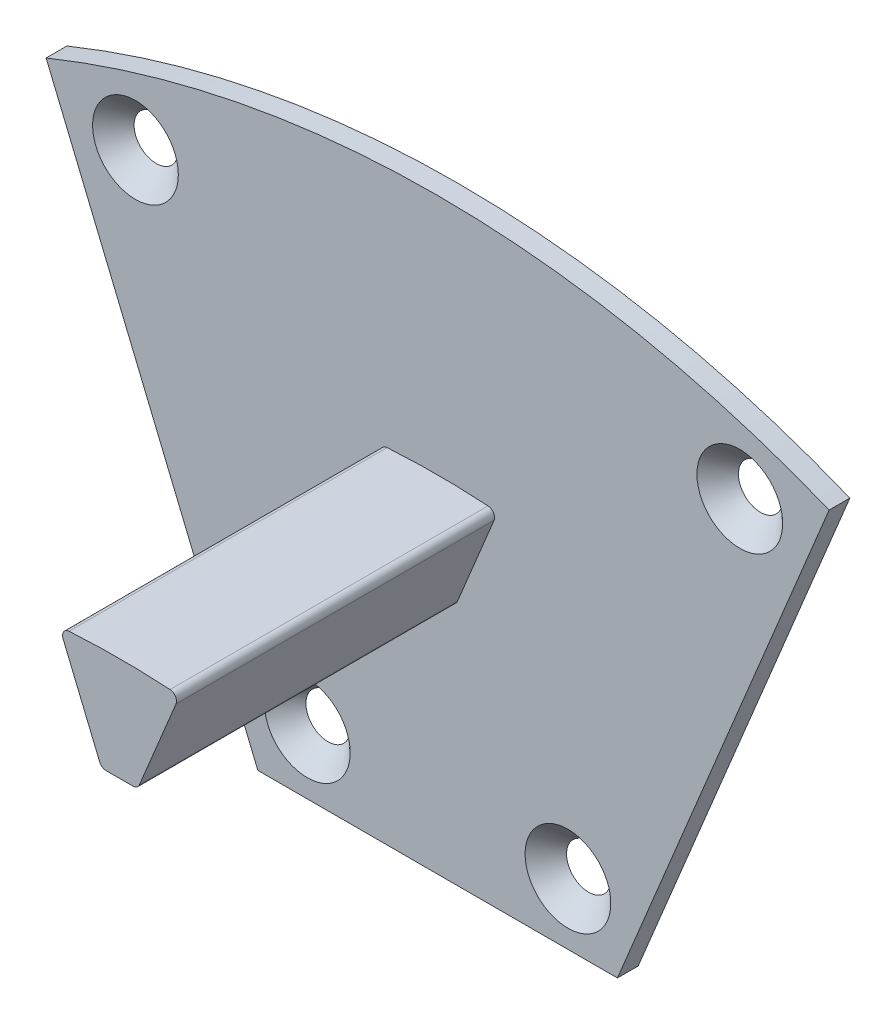
ISO-10303-21;
HEADER;
FILE_DESCRIPTION(('STEP AP214'),'2;1');
FILE_NAME('part.step','',(''),(''),'','','');
FILE_SCHEMA(('AUTOMOTIVE_DESIGN { 1 0 10303 214 1 1 1 1 }'));
ENDSEC;
DATA;
#1=APPLICATION_CONTEXT('core data for automotive mechanical design processes');
#2=APPLICATION_PROTOCOL_DEFINITION('international standard','automotive_design',2000,#1);
#3=PRODUCT_CONTEXT('',#1,'mechanical');
#4=PRODUCT('Part','Part','',(#3));
#5=PRODUCT_RELATED_PRODUCT_CATEGORY('part','',(#4));
#6=PRODUCT_DEFINITION_FORMATION('','',#4);
#7=PRODUCT_DEFINITION_CONTEXT('part definition',#1,'design');
#8=PRODUCT_DEFINITION('design','',#6,#7);
#9=PRODUCT_DEFINITION_SHAPE('','',#8);
#10=(LENGTH_UNIT() NAMED_UNIT(*) SI_UNIT(.MILLI.,.METRE.));
#11=(NAMED_UNIT(*) PLANE_ANGLE_UNIT() SI_UNIT($,.RADIAN.));
#12=(NAMED_UNIT(*) SI_UNIT($,.STERADIAN.) SOLID_ANGLE_UNIT());
#13=UNCERTAINTY_MEASURE_WITH_UNIT(LENGTH_MEASURE(1.E-05),#10,'distance_accuracy_value','');
#14=(GEOMETRIC_REPRESENTATION_CONTEXT(3) GLOBAL_UNCERTAINTY_ASSIGNED_CONTEXT((#13)) GLOBAL_UNIT_ASSIGNED_CONTEXT((#10,
#11,#12)) REPRESENTATION_CONTEXT('',''));
#15=CARTESIAN_POINT('',(0.,0.,0.));
#16=DIRECTION('',(0.,0.,1.));
#17=DIRECTION('',(1.,0.,0.));
#18=AXIS2_PLACEMENT_3D('',#15,#16,#17);
#19=CARTESIAN_POINT('',(0.,0.,-23.));
#20=DIRECTION('',(0.,0.,1.));
#21=DIRECTION('',(1.,0.,0.));
#22=AXIS2_PLACEMENT_3D('',#19,#20,#21);
#23=CYLINDRICAL_SURFACE('',#22,57.5);
#24=CARTESIAN_POINT('',(0.,0.,0.));
#25=DIRECTION('',(0.,0.,1.));
#26=DIRECTION('',(1.,0.,0.));
#27=AXIS2_PLACEMENT_3D('',#24,#25,#26);
#28=CIRCLE('',#27,57.5);
#29=CARTESIAN_POINT('',(3.65087331963527,57.3839796807783,0.));
#30=VERTEX_POINT('',#29);
#31=CARTESIAN_POINT('',(-3.65087331963523,57.3839796807783,0.));
#32=VERTEX_POINT('',#31);
#33=EDGE_CURVE('E279',#30,#32,#28,.T.);
#34=ORIENTED_EDGE('',*,*,#33,.F.);
#35=DIRECTION('',(0.,0.,1.));
#36=VECTOR('',#35,1.);
#37=CARTESIAN_POINT('',(3.65087331963527,57.3839796807783,-23.));
#38=LINE('',#37,#36);
#39=CARTESIAN_POINT('',(3.65087331963527,57.3839796807783,-23.));
#40=VERTEX_POINT('',#39);
#41=EDGE_CURVE('E94',#40,#30,#38,.T.);
#42=ORIENTED_EDGE('',*,*,#41,.F.);
#43=CARTESIAN_POINT('',(0.,0.,-23.));
#44=DIRECTION('',(0.,0.,1.));
#45=DIRECTION('',(1.,0.,0.));
#46=AXIS2_PLACEMENT_3D('',#43,#44,#45);
#47=CIRCLE('',#46,57.5);
#48=CARTESIAN_POINT('',(-3.65087331963523,57.3839796807783,-23.));
#49=VERTEX_POINT('',#48);
#50=EDGE_CURVE('E109',#40,#49,#47,.T.);
#51=ORIENTED_EDGE('',*,*,#50,.T.);
#52=DIRECTION('',(0.,0.,1.));
#53=VECTOR('',#52,1.);
#54=CARTESIAN_POINT('',(-3.65087331963523,57.3839796807783,-23.));
#55=LINE('',#54,#53);
#56=EDGE_CURVE('E127',#49,#32,#55,.T.);
#57=ORIENTED_EDGE('',*,*,#56,.T.);
#58=EDGE_LOOP('',(#34,#42,#51,#57));
#59=FACE_BOUND('',#58,.T.);
#60=ADVANCED_FACE('F35',(#59),#23,.T.);
#61=CARTESIAN_POINT('',(3.6191265951167,56.8849885531193,-23.));
#62=DIRECTION('',(0.,0.,1.));
#63=DIRECTION('',(1.,0.,0.));
#64=AXIS2_PLACEMENT_3D('',#61,#62,#63);
#65=CYLINDRICAL_SURFACE('',#64,0.499999999999993);
#66=CARTESIAN_POINT('',(3.6191265951167,56.8849885531193,0.));
#67=DIRECTION('',(0.,0.,1.));
#68=DIRECTION('',(1.,0.,0.));
#69=AXIS2_PLACEMENT_3D('',#66,#67,#68);
#70=CIRCLE('',#69,0.499999999999993);
#71=CARTESIAN_POINT('',(4.08106636137234,56.6936468369368,0.));
#72=VERTEX_POINT('',#71);
#73=EDGE_CURVE('E101',#72,#30,#70,.T.);
#74=ORIENTED_EDGE('',*,*,#73,.F.);
#75=DIRECTION('',(0.,0.,1.));
#76=VECTOR('',#75,1.);
#77=CARTESIAN_POINT('',(4.08106636137234,56.6936468369368,-23.));
#78=LINE('',#77,#76);
#79=CARTESIAN_POINT('',(4.08106636137234,56.6936468369368,-23.));
#80=VERTEX_POINT('',#79);
#81=EDGE_CURVE('E82',#80,#72,#78,.T.);
#82=ORIENTED_EDGE('',*,*,#81,.F.);
#83=CARTESIAN_POINT('',(3.6191265951167,56.8849885531193,-23.));
#84=DIRECTION('',(0.,0.,1.));
#85=DIRECTION('',(1.,0.,0.));
#86=AXIS2_PLACEMENT_3D('',#83,#84,#85);
#87=CIRCLE('',#86,0.499999999999993);
#88=EDGE_CURVE('E129',#80,#40,#87,.T.);
#89=ORIENTED_EDGE('',*,*,#88,.T.);
#90=ORIENTED_EDGE('',*,*,#41,.T.);
#91=EDGE_LOOP('',(#74,#82,#89,#90));
#92=FACE_BOUND('',#91,.T.);
#93=ADVANCED_FACE('F106',(#92),#65,.T.);
#94=CARTESIAN_POINT('',(1.43472428370819,50.3048119023613,-23.));
#95=DIRECTION('',(0.923879532511289,-0.382683432365084,0.));
#96=DIRECTION('',(0.382683432365084,0.923879532511289,0.));
#97=AXIS2_PLACEMENT_3D('',#94,#95,#96);
#98=PLANE('',#97);
#99=DIRECTION('',(0.382683432365084,0.923879532511289,0.));
#100=VECTOR('',#99,1.);
#101=CARTESIAN_POINT('',(1.43472428370819,50.3048119023613,0.));
#102=LINE('',#101,#100);
#103=CARTESIAN_POINT('',(1.43472428370819,50.3048119023613,0.));
#104=VERTEX_POINT('',#103);
#105=EDGE_CURVE('E86',#104,#72,#102,.T.);
#106=ORIENTED_EDGE('',*,*,#105,.F.);
#107=DIRECTION('',(0.,0.,1.));
#108=VECTOR('',#107,1.);
#109=CARTESIAN_POINT('',(1.43472428370819,50.3048119023613,-23.));
#110=LINE('',#109,#108);
#111=CARTESIAN_POINT('',(1.43472428370819,50.3048119023613,-23.));
#112=VERTEX_POINT('',#111);
#113=EDGE_CURVE('E95',#112,#104,#110,.T.);
#114=ORIENTED_EDGE('',*,*,#113,.F.);
#115=DIRECTION('',(0.382683432365084,0.923879532511289,0.));
#116=VECTOR('',#115,1.);
#117=CARTESIAN_POINT('',(1.43472428370819,50.3048119023613,-23.));
#118=LINE('',#117,#116);
#119=EDGE_CURVE('E90',#112,#80,#118,.T.);
#120=ORIENTED_EDGE('',*,*,#119,.T.);
#121=ORIENTED_EDGE('',*,*,#81,.T.);
#122=EDGE_LOOP('',(#106,#114,#120,#121));
#123=FACE_BOUND('',#122,.T.);
#124=ADVANCED_FACE('F84',(#123),#98,.T.);
#125=CARTESIAN_POINT('',(0.972784517452547,50.4961536185439,-23.));
#126=DIRECTION('',(0.,0.,1.));
#127=DIRECTION('',(1.,0.,0.));
#128=AXIS2_PLACEMENT_3D('',#125,#126,#127);
#129=CYLINDRICAL_SURFACE('',#128,0.5);
#130=CARTESIAN_POINT('',(0.972784517452547,50.4961536185439,0.));
#131=DIRECTION('',(0.,0.,1.));
#132=DIRECTION('',(1.,0.,0.));
#133=AXIS2_PLACEMENT_3D('',#130,#131,#132);
#134=CIRCLE('',#133,0.5);
#135=CARTESIAN_POINT('',(0.972784517452547,49.9961536185439,0.));
#136=VERTEX_POINT('',#135);
#137=EDGE_CURVE('E104',#136,#104,#134,.T.);
#138=ORIENTED_EDGE('',*,*,#137,.F.);
#139=DIRECTION('',(0.,0.,1.));
#140=VECTOR('',#139,1.);
#141=CARTESIAN_POINT('',(0.972784517452547,49.9961536185439,-23.));
#142=LINE('',#141,#140);
#143=CARTESIAN_POINT('',(0.972784517452547,49.9961536185439,-23.));
#144=VERTEX_POINT('',#143);
#145=EDGE_CURVE('E119',#144,#136,#142,.T.);
#146=ORIENTED_EDGE('',*,*,#145,.F.);
#147=CARTESIAN_POINT('',(0.972784517452547,50.4961536185439,-23.));
#148=DIRECTION('',(0.,0.,1.));
#149=DIRECTION('',(1.,0.,0.));
#150=AXIS2_PLACEMENT_3D('',#147,#148,#149);
#151=CIRCLE('',#150,0.5);
#152=EDGE_CURVE('E290',#144,#112,#151,.T.);
#153=ORIENTED_EDGE('',*,*,#152,.T.);
#154=ORIENTED_EDGE('',*,*,#113,.T.);
#155=EDGE_LOOP('',(#138,#146,#153,#154));
#156=FACE_BOUND('',#155,.T.);
#157=ADVANCED_FACE('F189',(#156),#129,.T.);
#158=CARTESIAN_POINT('',(-0.972784517452526,49.9961536185439,-23.));
#159=DIRECTION('',(0.,-1.,0.));
#160=DIRECTION('',(0.,0.,-1.));
#161=AXIS2_PLACEMENT_3D('',#158,#159,#160);
#162=PLANE('',#161);
#163=DIRECTION('',(1.,0.,0.));
#164=VECTOR('',#163,1.);
#165=CARTESIAN_POINT('',(-0.972784517452526,49.9961536185439,0.));
#166=LINE('',#165,#164);
#167=CARTESIAN_POINT('',(-0.972784517452526,49.9961536185439,0.));
#168=VERTEX_POINT('',#167);
#169=EDGE_CURVE('E305',#168,#136,#166,.T.);
#170=ORIENTED_EDGE('',*,*,#169,.F.);
#171=DIRECTION('',(0.,0.,1.));
#172=VECTOR('',#171,1.);
#173=CARTESIAN_POINT('',(-0.972784517452526,49.9961536185439,-23.));
#174=LINE('',#173,#172);
#175=CARTESIAN_POINT('',(-0.972784517452526,49.9961536185439,-23.));
#176=VERTEX_POINT('',#175);
#177=EDGE_CURVE('E121',#176,#168,#174,.T.);
#178=ORIENTED_EDGE('',*,*,#177,.F.);
#179=DIRECTION('',(1.,0.,0.));
#180=VECTOR('',#179,1.);
#181=CARTESIAN_POINT('',(-0.972784517452526,49.9961536185439,-23.));
#182=LINE('',#181,#180);
#183=EDGE_CURVE('E287',#176,#144,#182,.T.);
#184=ORIENTED_EDGE('',*,*,#183,.T.);
#185=ORIENTED_EDGE('',*,*,#145,.T.);
#186=EDGE_LOOP('',(#170,#178,#184,#185));
#187=FACE_BOUND('',#186,.T.);
#188=ADVANCED_FACE('F185',(#187),#162,.T.);
#189=CARTESIAN_POINT('',(-0.972784517452526,50.4961536185439,-23.));
#190=DIRECTION('',(0.,0.,1.));
#191=DIRECTION('',(1.,0.,0.));
#192=AXIS2_PLACEMENT_3D('',#189,#190,#191);
#193=CYLINDRICAL_SURFACE('',#192,0.5);
#194=CARTESIAN_POINT('',(-0.972784517452526,50.4961536185439,0.));
#195=DIRECTION('',(0.,0.,1.));
#196=DIRECTION('',(1.,0.,0.));
#197=AXIS2_PLACEMENT_3D('',#194,#195,#196);
#198=CIRCLE('',#197,0.5);
#199=CARTESIAN_POINT('',(-1.43472428370817,50.3048119023613,0.));
#200=VERTEX_POINT('',#199);
#201=EDGE_CURVE('E302',#200,#168,#198,.T.);
#202=ORIENTED_EDGE('',*,*,#201,.F.);
#203=DIRECTION('',(0.,0.,1.));
#204=VECTOR('',#203,1.);
#205=CARTESIAN_POINT('',(-1.43472428370817,50.3048119023613,-23.));
#206=LINE('',#205,#204);
#207=CARTESIAN_POINT('',(-1.43472428370817,50.3048119023613,-23.));
#208=VERTEX_POINT('',#207);
#209=EDGE_CURVE('E123',#208,#200,#206,.T.);
#210=ORIENTED_EDGE('',*,*,#209,.F.);
#211=CARTESIAN_POINT('',(-0.972784517452526,50.4961536185439,-23.));
#212=DIRECTION('',(0.,0.,1.));
#213=DIRECTION('',(1.,0.,0.));
#214=AXIS2_PLACEMENT_3D('',#211,#212,#213);
#215=CIRCLE('',#214,0.5);
#216=EDGE_CURVE('E284',#208,#176,#215,.T.);
#217=ORIENTED_EDGE('',*,*,#216,.T.);
#218=ORIENTED_EDGE('',*,*,#177,.T.);
#219=EDGE_LOOP('',(#202,#210,#217,#218));
#220=FACE_BOUND('',#219,.T.);
#221=ADVANCED_FACE('F181',(#220),#193,.T.);
#222=CARTESIAN_POINT('',(-4.08106636137231,56.6936468369368,-23.));
#223=DIRECTION('',(-0.92387953251129,-0.382683432365082,0.));
#224=DIRECTION('',(0.382683432365082,-0.92387953251129,0.));
#225=AXIS2_PLACEMENT_3D('',#222,#223,#224);
#226=PLANE('',#225);
#227=DIRECTION('',(0.382683432365082,-0.92387953251129,0.));
#228=VECTOR('',#227,1.);
#229=CARTESIAN_POINT('',(-4.08106636137231,56.6936468369368,0.));
#230=LINE('',#229,#228);
#231=CARTESIAN_POINT('',(-4.08106636137231,56.6936468369368,0.));
#232=VERTEX_POINT('',#231);
#233=EDGE_CURVE('E299',#232,#200,#230,.T.);
#234=ORIENTED_EDGE('',*,*,#233,.F.);
#235=DIRECTION('',(0.,0.,1.));
#236=VECTOR('',#235,1.);
#237=CARTESIAN_POINT('',(-4.08106636137231,56.6936468369368,-23.));
#238=LINE('',#237,#236);
#239=CARTESIAN_POINT('',(-4.08106636137231,56.6936468369368,-23.));
#240=VERTEX_POINT('',#239);
#241=EDGE_CURVE('E125',#240,#232,#238,.T.);
#242=ORIENTED_EDGE('',*,*,#241,.F.);
#243=DIRECTION('',(0.382683432365082,-0.92387953251129,0.));
#244=VECTOR('',#243,1.);
#245=CARTESIAN_POINT('',(-4.08106636137231,56.6936468369368,-23.));
#246=LINE('',#245,#244);
#247=EDGE_CURVE('E52',#240,#208,#246,.T.);
#248=ORIENTED_EDGE('',*,*,#247,.T.);
#249=ORIENTED_EDGE('',*,*,#209,.T.);
#250=EDGE_LOOP('',(#234,#242,#248,#249));
#251=FACE_BOUND('',#250,.T.);
#252=ADVANCED_FACE('F177',(#251),#226,.T.);
#253=CARTESIAN_POINT('',(-3.61912659511667,56.8849885531193,-23.));
#254=DIRECTION('',(0.,0.,1.));
#255=DIRECTION('',(1.,0.,0.));
#256=AXIS2_PLACEMENT_3D('',#253,#254,#255);
#257=CYLINDRICAL_SURFACE('',#256,0.499999999999987);
#258=CARTESIAN_POINT('',(-3.61912659511667,56.8849885531193,0.));
#259=DIRECTION('',(0.,0.,1.));
#260=DIRECTION('',(1.,0.,0.));
#261=AXIS2_PLACEMENT_3D('',#258,#259,#260);
#262=CIRCLE('',#261,0.499999999999987);
#263=EDGE_CURVE('E296',#32,#232,#262,.T.);
#264=ORIENTED_EDGE('',*,*,#263,.F.);
#265=ORIENTED_EDGE('',*,*,#56,.F.);
#266=CARTESIAN_POINT('',(-3.61912659511667,56.8849885531193,-23.));
#267=DIRECTION('',(0.,0.,1.));
#268=DIRECTION('',(1.,0.,0.));
#269=AXIS2_PLACEMENT_3D('',#266,#267,#268);
#270=CIRCLE('',#269,0.499999999999987);
#271=EDGE_CURVE('E112',#49,#240,#270,.T.);
#272=ORIENTED_EDGE('',*,*,#271,.T.);
#273=ORIENTED_EDGE('',*,*,#241,.T.);
#274=EDGE_LOOP('',(#264,#265,#272,#273));
#275=FACE_BOUND('',#274,.T.);
#276=ADVANCED_FACE('F164',(#275),#257,.T.);
#277=CARTESIAN_POINT('',(0.,0.,0.));
#278=DIRECTION('',(0.,0.,1.));
#279=DIRECTION('',(1.,0.,0.));
#280=AXIS2_PLACEMENT_3D('',#277,#278,#279);
#281=PLANE('',#280);
#282=ORIENTED_EDGE('',*,*,#33,.T.);
#283=ORIENTED_EDGE('',*,*,#263,.T.);
#284=ORIENTED_EDGE('',*,*,#233,.T.);
#285=ORIENTED_EDGE('',*,*,#201,.T.);
#286=ORIENTED_EDGE('',*,*,#169,.T.);
#287=ORIENTED_EDGE('',*,*,#137,.T.);
#288=ORIENTED_EDGE('',*,*,#105,.T.);
#289=ORIENTED_EDGE('',*,*,#73,.T.);
#290=EDGE_LOOP('',(#282,#283,#284,#285,#286,#287,#288,#289));
#291=FACE_BOUND('',#290,.T.);
#292=ADVANCED_FACE('F100',(#291),#281,.T.);
#293=CARTESIAN_POINT('',(0.,0.,-24.5));
#294=DIRECTION('',(0.,0.,-1.));
#295=DIRECTION('',(-1.,0.,0.));
#296=AXIS2_PLACEMENT_3D('',#293,#294,#295);
#297=PLANE('',#296);
#298=CARTESIAN_POINT('',(9.42252723540417,36.925,-24.5));
#299=DIRECTION('',(0.,0.,-1.));
#300=DIRECTION('',(-1.,0.,0.));
#301=AXIS2_PLACEMENT_3D('',#298,#299,#300);
#302=CIRCLE('',#301,1.6);
#303=CARTESIAN_POINT('',(7.82252723540417,36.925,-24.5));
#304=VERTEX_POINT('',#303);
#305=EDGE_CURVE('E223',#304,#304,#302,.T.);
#306=ORIENTED_EDGE('',*,*,#305,.F.);
#307=EDGE_LOOP('',(#306));
#308=FACE_BOUND('',#307,.T.);
#309=CARTESIAN_POINT('',(21.8489341065968,66.925,-24.5));
#310=DIRECTION('',(0.,0.,-1.));
#311=DIRECTION('',(-1.,0.,0.));
#312=AXIS2_PLACEMENT_3D('',#309,#310,#311);
#313=CIRCLE('',#312,1.60000000000001);
#314=CARTESIAN_POINT('',(20.2489341065968,66.925,-24.5));
#315=VERTEX_POINT('',#314);
#316=EDGE_CURVE('E227',#315,#315,#313,.T.);
#317=ORIENTED_EDGE('',*,*,#316,.F.);
#318=EDGE_LOOP('',(#317));
#319=FACE_BOUND('',#318,.T.);
#320=CARTESIAN_POINT('',(0.,0.,-24.5));
#321=DIRECTION('',(0.,0.,-1.));
#322=DIRECTION('',(-1.,0.,0.));
#323=AXIS2_PLACEMENT_3D('',#320,#321,#322);
#324=CIRCLE('',#323,75.);
#325=CARTESIAN_POINT('',(-28.3078647305513,69.4526082620143,-24.5));
#326=VERTEX_POINT('',#325);
#327=CARTESIAN_POINT('',(28.3078647305513,69.4526082620142,-24.5));
#328=VERTEX_POINT('',#327);
#329=EDGE_CURVE('E234',#326,#328,#324,.T.);
#330=ORIENTED_EDGE('',*,*,#329,.T.);
#331=DIRECTION('',(-0.382683432365084,-0.923879532511289,0.));
#332=VECTOR('',#331,1.);
#333=CARTESIAN_POINT('',(28.3078647305513,69.4526082620142,-24.5));
#334=LINE('',#333,#332);
#335=CARTESIAN_POINT('',(13.,32.4961536185439,-24.5));
#336=VERTEX_POINT('',#335);
#337=EDGE_CURVE('E250',#328,#336,#334,.T.);
#338=ORIENTED_EDGE('',*,*,#337,.T.);
#339=DIRECTION('',(-1.,0.,0.));
#340=VECTOR('',#339,1.);
#341=CARTESIAN_POINT('',(13.,32.4961536185439,-24.5));
#342=LINE('',#341,#340);
#343=CARTESIAN_POINT('',(-13.,32.4961536185439,-24.5));
#344=VERTEX_POINT('',#343);
#345=EDGE_CURVE('E253',#336,#344,#342,.T.);
#346=ORIENTED_EDGE('',*,*,#345,.T.);
#347=DIRECTION('',(-0.382683432365084,0.923879532511289,0.));
#348=VECTOR('',#347,1.);
#349=CARTESIAN_POINT('',(-13.,32.4961536185439,-24.5));
#350=LINE('',#349,#348);
#351=EDGE_CURVE('E256',#344,#326,#350,.T.);
#352=ORIENTED_EDGE('',*,*,#351,.T.);
#353=EDGE_LOOP('',(#330,#338,#346,#352));
#354=FACE_BOUND('',#353,.T.);
#355=CARTESIAN_POINT('',(-21.8489341065968,66.925,-24.5));
#356=DIRECTION('',(0.,0.,-1.));
#357=DIRECTION('',(1.,0.,0.));
#358=AXIS2_PLACEMENT_3D('',#355,#356,#357);
#359=CIRCLE('',#358,1.60000000000001);
#360=CARTESIAN_POINT('',(-20.2489341065968,66.925,-24.5));
#361=VERTEX_POINT('',#360);
#362=EDGE_CURVE('E239',#361,#361,#359,.T.);
#363=ORIENTED_EDGE('',*,*,#362,.F.);
#364=EDGE_LOOP('',(#363));
#365=FACE_BOUND('',#364,.T.);
#366=CARTESIAN_POINT('',(-9.42252723540417,36.925,-24.5));
#367=DIRECTION('',(0.,0.,-1.));
#368=DIRECTION('',(1.,0.,0.));
#369=AXIS2_PLACEMENT_3D('',#366,#367,#368);
#370=CIRCLE('',#369,1.6);
#371=CARTESIAN_POINT('',(-7.82252723540417,36.925,-24.5));
#372=VERTEX_POINT('',#371);
#373=EDGE_CURVE('E242',#372,#372,#370,.T.);
#374=ORIENTED_EDGE('',*,*,#373,.F.);
#375=EDGE_LOOP('',(#374));
#376=FACE_BOUND('',#375,.T.);
#377=ADVANCED_FACE('F198',(#308,#319,#354,#365,#376),#297,.T.);
#378=CARTESIAN_POINT('',(0.,0.,-23.));
#379=DIRECTION('',(0.,0.,-1.));
#380=DIRECTION('',(-1.,0.,0.));
#381=AXIS2_PLACEMENT_3D('',#378,#379,#380);
#382=PLANE('',#381);
#383=CARTESIAN_POINT('',(21.8489341065968,66.925,-23.));
#384=DIRECTION('',(0.,0.,-1.));
#385=DIRECTION('',(-1.,0.,0.));
#386=AXIS2_PLACEMENT_3D('',#383,#384,#385);
#387=CIRCLE('',#386,3.10000000000001);
#388=CARTESIAN_POINT('',(18.7489341065968,66.925,-23.));
#389=VERTEX_POINT('',#388);
#390=EDGE_CURVE('E11',#389,#389,#387,.T.);
#391=ORIENTED_EDGE('',*,*,#390,.T.);
#392=EDGE_LOOP('',(#391));
#393=FACE_BOUND('',#392,.T.);
#394=CARTESIAN_POINT('',(9.42252723540417,36.925,-23.));
#395=DIRECTION('',(0.,0.,-1.));
#396=DIRECTION('',(-1.,0.,0.));
#397=AXIS2_PLACEMENT_3D('',#394,#395,#396);
#398=CIRCLE('',#397,3.10000000000001);
#399=CARTESIAN_POINT('',(6.32252723540416,36.925,-23.));
#400=VERTEX_POINT('',#399);
#401=EDGE_CURVE('E45',#400,#400,#398,.T.);
#402=ORIENTED_EDGE('',*,*,#401,.T.);
#403=EDGE_LOOP('',(#402));
#404=FACE_BOUND('',#403,.T.);
#405=CARTESIAN_POINT('',(-9.42252723540417,36.925,-23.));
#406=DIRECTION('',(0.,0.,-1.));
#407=DIRECTION('',(-1.,0.,0.));
#408=AXIS2_PLACEMENT_3D('',#405,#406,#407);
#409=CIRCLE('',#408,3.10000000000001);
#410=CARTESIAN_POINT('',(-12.5225272354042,36.925,-23.));
#411=VERTEX_POINT('',#410);
#412=EDGE_CURVE('E132',#411,#411,#409,.T.);
#413=ORIENTED_EDGE('',*,*,#412,.T.);
#414=EDGE_LOOP('',(#413));
#415=FACE_BOUND('',#414,.T.);
#416=CARTESIAN_POINT('',(-21.8489341065968,66.925,-23.));
#417=DIRECTION('',(0.,0.,-1.));
#418=DIRECTION('',(-1.,0.,0.));
#419=AXIS2_PLACEMENT_3D('',#416,#417,#418);
#420=CIRCLE('',#419,3.10000000000001);
#421=CARTESIAN_POINT('',(-24.9489341065968,66.925,-23.));
#422=VERTEX_POINT('',#421);
#423=EDGE_CURVE('E116',#422,#422,#420,.T.);
#424=ORIENTED_EDGE('',*,*,#423,.T.);
#425=EDGE_LOOP('',(#424));
#426=FACE_BOUND('',#425,.T.);
#427=ORIENTED_EDGE('',*,*,#50,.F.);
#428=ORIENTED_EDGE('',*,*,#88,.F.);
#429=ORIENTED_EDGE('',*,*,#119,.F.);
#430=ORIENTED_EDGE('',*,*,#152,.F.);
#431=ORIENTED_EDGE('',*,*,#183,.F.);
#432=ORIENTED_EDGE('',*,*,#216,.F.);
#433=ORIENTED_EDGE('',*,*,#247,.F.);
#434=ORIENTED_EDGE('',*,*,#271,.F.);
#435=EDGE_LOOP('',(#427,#428,#429,#430,#431,#432,#433,#434));
#436=FACE_BOUND('',#435,.T.);
#437=CARTESIAN_POINT('',(0.,0.,-23.));
#438=DIRECTION('',(0.,0.,-1.));
#439=DIRECTION('',(-1.,0.,0.));
#440=AXIS2_PLACEMENT_3D('',#437,#438,#439);
#441=CIRCLE('',#440,75.);
#442=CARTESIAN_POINT('',(-28.3078647305513,69.4526082620143,-23.));
#443=VERTEX_POINT('',#442);
#444=CARTESIAN_POINT('',(28.3078647305513,69.4526082620142,-23.));
#445=VERTEX_POINT('',#444);
#446=EDGE_CURVE('E248',#443,#445,#441,.T.);
#447=ORIENTED_EDGE('',*,*,#446,.F.);
#448=DIRECTION('',(-0.382683432365084,0.923879532511289,0.));
#449=VECTOR('',#448,1.);
#450=CARTESIAN_POINT('',(-13.,32.4961536185439,-23.));
#451=LINE('',#450,#449);
#452=CARTESIAN_POINT('',(-13.,32.4961536185439,-23.));
#453=VERTEX_POINT('',#452);
#454=EDGE_CURVE('E251',#453,#443,#451,.T.);
#455=ORIENTED_EDGE('',*,*,#454,.F.);
#456=DIRECTION('',(-1.,0.,0.));
#457=VECTOR('',#456,1.);
#458=CARTESIAN_POINT('',(13.,32.4961536185439,-23.));
#459=LINE('',#458,#457);
#460=CARTESIAN_POINT('',(13.,32.4961536185439,-23.));
#461=VERTEX_POINT('',#460);
#462=EDGE_CURVE('E264',#461,#453,#459,.T.);
#463=ORIENTED_EDGE('',*,*,#462,.F.);
#464=DIRECTION('',(-0.382683432365084,-0.923879532511289,0.));
#465=VECTOR('',#464,1.);
#466=CARTESIAN_POINT('',(28.3078647305513,69.4526082620142,-23.));
#467=LINE('',#466,#465);
#468=EDGE_CURVE('E261',#445,#461,#467,.T.);
#469=ORIENTED_EDGE('',*,*,#468,.F.);
#470=EDGE_LOOP('',(#447,#455,#463,#469));
#471=FACE_BOUND('',#470,.T.);
#472=ADVANCED_FACE('F137',(#393,#404,#415,#426,#436,#471),#382,.F.);
#473=CARTESIAN_POINT('',(0.,0.,-24.5));
#474=DIRECTION('',(0.,0.,1.));
#475=DIRECTION('',(1.,0.,0.));
#476=AXIS2_PLACEMENT_3D('',#473,#474,#475);
#477=CYLINDRICAL_SURFACE('',#476,75.);
#478=ORIENTED_EDGE('',*,*,#446,.T.);
#479=DIRECTION('',(0.,0.,1.));
#480=VECTOR('',#479,1.);
#481=CARTESIAN_POINT('',(28.3078647305513,69.4526082620142,-24.5));
#482=LINE('',#481,#480);
#483=EDGE_CURVE('E277',#328,#445,#482,.T.);
#484=ORIENTED_EDGE('',*,*,#483,.F.);
#485=ORIENTED_EDGE('',*,*,#329,.F.);
#486=DIRECTION('',(0.,0.,1.));
#487=VECTOR('',#486,1.);
#488=CARTESIAN_POINT('',(-28.3078647305513,69.4526082620143,-24.5));
#489=LINE('',#488,#487);
#490=EDGE_CURVE('E258',#326,#443,#489,.T.);
#491=ORIENTED_EDGE('',*,*,#490,.T.);
#492=EDGE_LOOP('',(#478,#484,#485,#491));
#493=FACE_BOUND('',#492,.T.);
#494=ADVANCED_FACE('F199',(#493),#477,.T.);
#495=CARTESIAN_POINT('',(28.3078647305513,69.4526082620142,-24.5));
#496=DIRECTION('',(-0.923879532511289,0.382683432365084,0.));
#497=DIRECTION('',(-0.382683432365084,-0.923879532511289,0.));
#498=AXIS2_PLACEMENT_3D('',#495,#496,#497);
#499=PLANE('',#498);
#500=ORIENTED_EDGE('',*,*,#468,.T.);
#501=DIRECTION('',(0.,0.,1.));
#502=VECTOR('',#501,1.);
#503=CARTESIAN_POINT('',(13.,32.4961536185439,-24.5));
#504=LINE('',#503,#502);
#505=EDGE_CURVE('E274',#336,#461,#504,.T.);
#506=ORIENTED_EDGE('',*,*,#505,.F.);
#507=ORIENTED_EDGE('',*,*,#337,.F.);
#508=ORIENTED_EDGE('',*,*,#483,.T.);
#509=EDGE_LOOP('',(#500,#506,#507,#508));
#510=FACE_BOUND('',#509,.T.);
#511=ADVANCED_FACE('F202',(#510),#499,.F.);
#512=CARTESIAN_POINT('',(13.,32.4961536185439,-24.5));
#513=DIRECTION('',(0.,1.,0.));
#514=DIRECTION('',(-1.,0.,0.));
#515=AXIS2_PLACEMENT_3D('',#512,#513,#514);
#516=PLANE('',#515);
#517=ORIENTED_EDGE('',*,*,#462,.T.);
#518=DIRECTION('',(0.,0.,1.));
#519=VECTOR('',#518,1.);
#520=CARTESIAN_POINT('',(-13.,32.4961536185439,-24.5));
#521=LINE('',#520,#519);
#522=EDGE_CURVE('E271',#344,#453,#521,.T.);
#523=ORIENTED_EDGE('',*,*,#522,.F.);
#524=ORIENTED_EDGE('',*,*,#345,.F.);
#525=ORIENTED_EDGE('',*,*,#505,.T.);
#526=EDGE_LOOP('',(#517,#523,#524,#525));
#527=FACE_BOUND('',#526,.T.);
#528=ADVANCED_FACE('F206',(#527),#516,.F.);
#529=CARTESIAN_POINT('',(-13.,32.4961536185439,-24.5));
#530=DIRECTION('',(0.923879532511289,0.382683432365084,0.));
#531=DIRECTION('',(-0.382683432365084,0.923879532511289,0.));
#532=AXIS2_PLACEMENT_3D('',#529,#530,#531);
#533=PLANE('',#532);
#534=ORIENTED_EDGE('',*,*,#454,.T.);
#535=ORIENTED_EDGE('',*,*,#490,.F.);
#536=ORIENTED_EDGE('',*,*,#351,.F.);
#537=ORIENTED_EDGE('',*,*,#522,.T.);
#538=EDGE_LOOP('',(#534,#535,#536,#537));
#539=FACE_BOUND('',#538,.T.);
#540=ADVANCED_FACE('F151',(#539),#533,.F.);
#541=CARTESIAN_POINT('',(21.8489341065968,66.925,-23.));
#542=DIRECTION('',(0.,0.,1.));
#543=DIRECTION('',(1.,0.,0.));
#544=AXIS2_PLACEMENT_3D('',#541,#542,#543);
#545=CONICAL_SURFACE('',#544,3.10000000000001,0.785398163397447);
#546=ORIENTED_EDGE('',*,*,#316,.T.);
#547=EDGE_LOOP('',(#546));
#548=FACE_BOUND('',#547,.T.);
#549=ORIENTED_EDGE('',*,*,#390,.F.);
#550=EDGE_LOOP('',(#549));
#551=FACE_BOUND('',#550,.T.);
#552=ADVANCED_FACE('F143',(#548,#551),#545,.F.);
#553=CARTESIAN_POINT('',(9.42252723540417,36.925,-23.));
#554=DIRECTION('',(0.,0.,1.));
#555=DIRECTION('',(1.,0.,0.));
#556=AXIS2_PLACEMENT_3D('',#553,#554,#555);
#557=CONICAL_SURFACE('',#556,3.10000000000001,0.785398163397446);
#558=ORIENTED_EDGE('',*,*,#305,.T.);
#559=EDGE_LOOP('',(#558));
#560=FACE_BOUND('',#559,.T.);
#561=ORIENTED_EDGE('',*,*,#401,.F.);
#562=EDGE_LOOP('',(#561));
#563=FACE_BOUND('',#562,.T.);
#564=ADVANCED_FACE('F140',(#560,#563),#557,.F.);
#565=CARTESIAN_POINT('',(-9.42252723540417,36.925,-23.));
#566=DIRECTION('',(0.,0.,1.));
#567=DIRECTION('',(1.,0.,0.));
#568=AXIS2_PLACEMENT_3D('',#565,#566,#567);
#569=CONICAL_SURFACE('',#568,3.10000000000001,0.785398163397446);
#570=ORIENTED_EDGE('',*,*,#373,.T.);
#571=EDGE_LOOP('',(#570));
#572=FACE_BOUND('',#571,.T.);
#573=ORIENTED_EDGE('',*,*,#412,.F.);
#574=EDGE_LOOP('',(#573));
#575=FACE_BOUND('',#574,.T.);
#576=ADVANCED_FACE('F142',(#572,#575),#569,.F.);
#577=CARTESIAN_POINT('',(-21.8489341065968,66.925,-23.));
#578=DIRECTION('',(0.,0.,1.));
#579=DIRECTION('',(1.,0.,0.));
#580=AXIS2_PLACEMENT_3D('',#577,#578,#579);
#581=CONICAL_SURFACE('',#580,3.10000000000001,0.785398163397447);
#582=ORIENTED_EDGE('',*,*,#362,.T.);
#583=EDGE_LOOP('',(#582));
#584=FACE_BOUND('',#583,.T.);
#585=ORIENTED_EDGE('',*,*,#423,.F.);
#586=EDGE_LOOP('',(#585));
#587=FACE_BOUND('',#586,.T.);
#588=ADVANCED_FACE('F38',(#584,#587),#581,.F.);
#589=CLOSED_SHELL('',(#60,#93,#124,#157,#188,#221,#252,#276,#292,#377,#472,#494,#511,#528,#540,
#552,#564,#576,#588));
#590=MANIFOLD_SOLID_BREP('B2',#589);
#591=ADVANCED_BREP_SHAPE_REPRESENTATION('',(#18,#590),#14);
#592=SHAPE_DEFINITION_REPRESENTATION(#9,#591);
ENDSEC;
END-ISO-10303-21;
